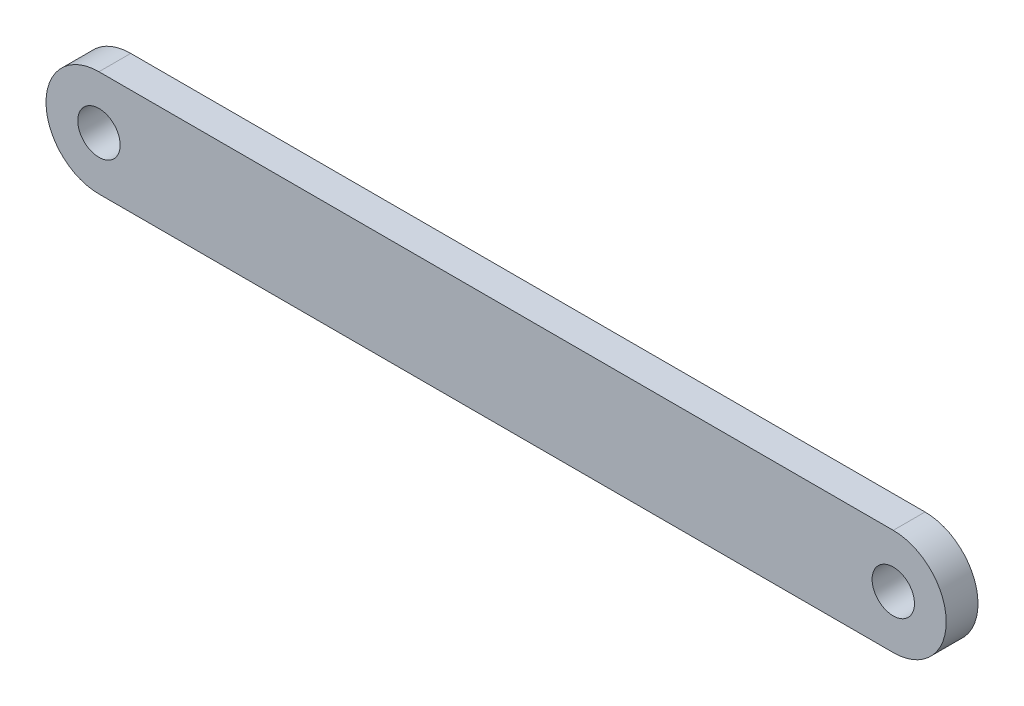
ISO-10303-21;
HEADER;
FILE_DESCRIPTION(('STEP AP214'),'2;1');
FILE_NAME('part.step','',(''),(''),'','','');
FILE_SCHEMA(('AUTOMOTIVE_DESIGN { 1 0 10303 214 1 1 1 1 }'));
ENDSEC;
DATA;
#1=APPLICATION_CONTEXT('core data for automotive mechanical design processes');
#2=APPLICATION_PROTOCOL_DEFINITION('international standard','automotive_design',2000,#1);
#3=PRODUCT_CONTEXT('',#1,'mechanical');
#4=PRODUCT('Part','Part','',(#3));
#5=PRODUCT_RELATED_PRODUCT_CATEGORY('part','',(#4));
#6=PRODUCT_DEFINITION_FORMATION('','',#4);
#7=PRODUCT_DEFINITION_CONTEXT('part definition',#1,'design');
#8=PRODUCT_DEFINITION('design','',#6,#7);
#9=PRODUCT_DEFINITION_SHAPE('','',#8);
#10=(LENGTH_UNIT() NAMED_UNIT(*) SI_UNIT(.MILLI.,.METRE.));
#11=(NAMED_UNIT(*) PLANE_ANGLE_UNIT() SI_UNIT($,.RADIAN.));
#12=(NAMED_UNIT(*) SI_UNIT($,.STERADIAN.) SOLID_ANGLE_UNIT());
#13=UNCERTAINTY_MEASURE_WITH_UNIT(LENGTH_MEASURE(1.E-05),#10,'distance_accuracy_value','');
#14=(GEOMETRIC_REPRESENTATION_CONTEXT(3) GLOBAL_UNCERTAINTY_ASSIGNED_CONTEXT((#13)) GLOBAL_UNIT_ASSIGNED_CONTEXT((#10,
#11,#12)) REPRESENTATION_CONTEXT('',''));
#15=CARTESIAN_POINT('',(0.,0.,0.));
#16=DIRECTION('',(0.,0.,1.));
#17=DIRECTION('',(1.,0.,0.));
#18=AXIS2_PLACEMENT_3D('',#15,#16,#17);
#19=CARTESIAN_POINT('',(120.078651701107,195.032322866027,3.));
#20=DIRECTION('',(0.,0.,1.));
#21=DIRECTION('',(1.,0.,0.));
#22=AXIS2_PLACEMENT_3D('',#19,#20,#21);
#23=PLANE('',#22);
#24=CARTESIAN_POINT('',(120.078651701107,195.032322866027,3.));
#25=DIRECTION('',(0.,0.,1.));
#26=DIRECTION('',(1.,0.,0.));
#27=AXIS2_PLACEMENT_3D('',#24,#25,#26);
#28=CIRCLE('',#27,2.);
#29=CARTESIAN_POINT('',(122.078651701107,195.032322866027,3.));
#30=VERTEX_POINT('',#29);
#31=EDGE_CURVE('E100',#30,#30,#28,.T.);
#32=ORIENTED_EDGE('',*,*,#31,.F.);
#33=EDGE_LOOP('',(#32));
#34=FACE_BOUND('',#33,.T.);
#35=CARTESIAN_POINT('',(120.078651701107,195.032322866027,3.));
#36=DIRECTION('',(0.,0.,1.));
#37=DIRECTION('',(1.,0.,0.));
#38=AXIS2_PLACEMENT_3D('',#35,#36,#37);
#39=CIRCLE('',#38,4.99999999999999);
#40=CARTESIAN_POINT('',(120.078651701107,200.032322866027,3.));
#41=VERTEX_POINT('',#40);
#42=CARTESIAN_POINT('',(120.078651701107,190.032322866027,3.));
#43=VERTEX_POINT('',#42);
#44=EDGE_CURVE('E85',#41,#43,#39,.T.);
#45=ORIENTED_EDGE('',*,*,#44,.T.);
#46=DIRECTION('',(1.,0.,0.));
#47=VECTOR('',#46,1.);
#48=CARTESIAN_POINT('',(120.078651701107,190.032322866027,3.));
#49=LINE('',#48,#47);
#50=CARTESIAN_POINT('',(195.078651701107,190.032322866027,3.));
#51=VERTEX_POINT('',#50);
#52=EDGE_CURVE('E80',#43,#51,#49,.T.);
#53=ORIENTED_EDGE('',*,*,#52,.T.);
#54=CARTESIAN_POINT('',(195.078651701107,195.032322866027,3.));
#55=DIRECTION('',(0.,0.,1.));
#56=DIRECTION('',(-1.,0.,0.));
#57=AXIS2_PLACEMENT_3D('',#54,#55,#56);
#58=CIRCLE('',#57,5.);
#59=CARTESIAN_POINT('',(195.078651701107,200.032322866027,3.));
#60=VERTEX_POINT('',#59);
#61=EDGE_CURVE('E83',#51,#60,#58,.T.);
#62=ORIENTED_EDGE('',*,*,#61,.T.);
#63=DIRECTION('',(-1.,0.,0.));
#64=VECTOR('',#63,1.);
#65=CARTESIAN_POINT('',(120.078651701107,200.032322866027,3.));
#66=LINE('',#65,#64);
#67=EDGE_CURVE('E50',#60,#41,#66,.T.);
#68=ORIENTED_EDGE('',*,*,#67,.T.);
#69=EDGE_LOOP('',(#45,#53,#62,#68));
#70=FACE_BOUND('',#69,.T.);
#71=CARTESIAN_POINT('',(195.078651701107,195.032322866027,3.));
#72=DIRECTION('',(0.,0.,1.));
#73=DIRECTION('',(1.,0.,0.));
#74=AXIS2_PLACEMENT_3D('',#71,#72,#73);
#75=CIRCLE('',#74,2.);
#76=CARTESIAN_POINT('',(197.078651701107,195.032322866027,3.));
#77=VERTEX_POINT('',#76);
#78=EDGE_CURVE('E115',#77,#77,#75,.T.);
#79=ORIENTED_EDGE('',*,*,#78,.F.);
#80=EDGE_LOOP('',(#79));
#81=FACE_BOUND('',#80,.T.);
#82=ADVANCED_FACE('F33',(#34,#70,#81),#23,.T.);
#83=CARTESIAN_POINT('',(120.078651701107,195.032322866027,0.));
#84=DIRECTION('',(0.,0.,1.));
#85=DIRECTION('',(1.,0.,0.));
#86=AXIS2_PLACEMENT_3D('',#83,#84,#85);
#87=PLANE('',#86);
#88=CARTESIAN_POINT('',(120.078651701107,195.032322866027,0.));
#89=DIRECTION('',(0.,0.,1.));
#90=DIRECTION('',(1.,0.,0.));
#91=AXIS2_PLACEMENT_3D('',#88,#89,#90);
#92=CIRCLE('',#91,4.99999999999999);
#93=CARTESIAN_POINT('',(120.078651701107,200.032322866027,0.));
#94=VERTEX_POINT('',#93);
#95=CARTESIAN_POINT('',(120.078651701107,190.032322866027,0.));
#96=VERTEX_POINT('',#95);
#97=EDGE_CURVE('E97',#94,#96,#92,.T.);
#98=ORIENTED_EDGE('',*,*,#97,.F.);
#99=DIRECTION('',(-1.,0.,0.));
#100=VECTOR('',#99,1.);
#101=CARTESIAN_POINT('',(120.078651701107,200.032322866027,0.));
#102=LINE('',#101,#100);
#103=CARTESIAN_POINT('',(195.078651701107,200.032322866027,0.));
#104=VERTEX_POINT('',#103);
#105=EDGE_CURVE('E73',#104,#94,#102,.T.);
#106=ORIENTED_EDGE('',*,*,#105,.F.);
#107=CARTESIAN_POINT('',(195.078651701107,195.032322866027,0.));
#108=DIRECTION('',(0.,0.,1.));
#109=DIRECTION('',(-1.,0.,0.));
#110=AXIS2_PLACEMENT_3D('',#107,#108,#109);
#111=CIRCLE('',#110,5.);
#112=CARTESIAN_POINT('',(195.078651701107,190.032322866027,0.));
#113=VERTEX_POINT('',#112);
#114=EDGE_CURVE('E67',#113,#104,#111,.T.);
#115=ORIENTED_EDGE('',*,*,#114,.F.);
#116=DIRECTION('',(1.,0.,0.));
#117=VECTOR('',#116,1.);
#118=CARTESIAN_POINT('',(120.078651701107,190.032322866027,0.));
#119=LINE('',#118,#117);
#120=EDGE_CURVE('E89',#96,#113,#119,.T.);
#121=ORIENTED_EDGE('',*,*,#120,.F.);
#122=EDGE_LOOP('',(#98,#106,#115,#121));
#123=FACE_BOUND('',#122,.T.);
#124=CARTESIAN_POINT('',(120.078651701107,195.032322866027,0.));
#125=DIRECTION('',(0.,0.,1.));
#126=DIRECTION('',(1.,0.,0.));
#127=AXIS2_PLACEMENT_3D('',#124,#125,#126);
#128=CIRCLE('',#127,2.);
#129=CARTESIAN_POINT('',(122.078651701107,195.032322866027,0.));
#130=VERTEX_POINT('',#129);
#131=EDGE_CURVE('E112',#130,#130,#128,.T.);
#132=ORIENTED_EDGE('',*,*,#131,.T.);
#133=EDGE_LOOP('',(#132));
#134=FACE_BOUND('',#133,.T.);
#135=CARTESIAN_POINT('',(195.078651701107,195.032322866027,0.));
#136=DIRECTION('',(0.,0.,1.));
#137=DIRECTION('',(1.,0.,0.));
#138=AXIS2_PLACEMENT_3D('',#135,#136,#137);
#139=CIRCLE('',#138,2.);
#140=CARTESIAN_POINT('',(197.078651701107,195.032322866027,0.));
#141=VERTEX_POINT('',#140);
#142=EDGE_CURVE('E118',#141,#141,#139,.T.);
#143=ORIENTED_EDGE('',*,*,#142,.T.);
#144=EDGE_LOOP('',(#143));
#145=FACE_BOUND('',#144,.T.);
#146=ADVANCED_FACE('F108',(#123,#134,#145),#87,.F.);
#147=CARTESIAN_POINT('',(120.078651701107,195.032322866027,3.));
#148=DIRECTION('',(0.,0.,-1.));
#149=DIRECTION('',(-1.,0.,0.));
#150=AXIS2_PLACEMENT_3D('',#147,#148,#149);
#151=CYLINDRICAL_SURFACE('',#150,4.99999999999999);
#152=ORIENTED_EDGE('',*,*,#97,.T.);
#153=DIRECTION('',(0.,0.,-1.));
#154=VECTOR('',#153,1.);
#155=CARTESIAN_POINT('',(120.078651701107,190.032322866027,3.));
#156=LINE('',#155,#154);
#157=EDGE_CURVE('E11',#43,#96,#156,.T.);
#158=ORIENTED_EDGE('',*,*,#157,.F.);
#159=ORIENTED_EDGE('',*,*,#44,.F.);
#160=DIRECTION('',(0.,0.,-1.));
#161=VECTOR('',#160,1.);
#162=CARTESIAN_POINT('',(120.078651701107,200.032322866027,3.));
#163=LINE('',#162,#161);
#164=EDGE_CURVE('E93',#41,#94,#163,.T.);
#165=ORIENTED_EDGE('',*,*,#164,.T.);
#166=EDGE_LOOP('',(#152,#158,#159,#165));
#167=FACE_BOUND('',#166,.T.);
#168=ADVANCED_FACE('F35',(#167),#151,.T.);
#169=CARTESIAN_POINT('',(120.078651701107,190.032322866027,3.));
#170=DIRECTION('',(0.,1.,0.));
#171=DIRECTION('',(0.,0.,1.));
#172=AXIS2_PLACEMENT_3D('',#169,#170,#171);
#173=PLANE('',#172);
#174=ORIENTED_EDGE('',*,*,#120,.T.);
#175=DIRECTION('',(0.,0.,-1.));
#176=VECTOR('',#175,1.);
#177=CARTESIAN_POINT('',(195.078651701107,190.032322866027,3.));
#178=LINE('',#177,#176);
#179=EDGE_CURVE('E42',#51,#113,#178,.T.);
#180=ORIENTED_EDGE('',*,*,#179,.F.);
#181=ORIENTED_EDGE('',*,*,#52,.F.);
#182=ORIENTED_EDGE('',*,*,#157,.T.);
#183=EDGE_LOOP('',(#174,#180,#181,#182));
#184=FACE_BOUND('',#183,.T.);
#185=ADVANCED_FACE('F88',(#184),#173,.F.);
#186=CARTESIAN_POINT('',(195.078651701107,195.032322866027,3.));
#187=DIRECTION('',(0.,0.,-1.));
#188=DIRECTION('',(-1.,0.,0.));
#189=AXIS2_PLACEMENT_3D('',#186,#187,#188);
#190=CYLINDRICAL_SURFACE('',#189,5.);
#191=ORIENTED_EDGE('',*,*,#114,.T.);
#192=DIRECTION('',(0.,0.,-1.));
#193=VECTOR('',#192,1.);
#194=CARTESIAN_POINT('',(195.078651701107,200.032322866027,3.));
#195=LINE('',#194,#193);
#196=EDGE_CURVE('E90',#60,#104,#195,.T.);
#197=ORIENTED_EDGE('',*,*,#196,.F.);
#198=ORIENTED_EDGE('',*,*,#61,.F.);
#199=ORIENTED_EDGE('',*,*,#179,.T.);
#200=EDGE_LOOP('',(#191,#197,#198,#199));
#201=FACE_BOUND('',#200,.T.);
#202=ADVANCED_FACE('F91',(#201),#190,.T.);
#203=CARTESIAN_POINT('',(120.078651701107,200.032322866027,3.));
#204=DIRECTION('',(0.,-1.,0.));
#205=DIRECTION('',(1.,0.,0.));
#206=AXIS2_PLACEMENT_3D('',#203,#204,#205);
#207=PLANE('',#206);
#208=ORIENTED_EDGE('',*,*,#105,.T.);
#209=ORIENTED_EDGE('',*,*,#164,.F.);
#210=ORIENTED_EDGE('',*,*,#67,.F.);
#211=ORIENTED_EDGE('',*,*,#196,.T.);
#212=EDGE_LOOP('',(#208,#209,#210,#211));
#213=FACE_BOUND('',#212,.T.);
#214=ADVANCED_FACE('F105',(#213),#207,.F.);
#215=CARTESIAN_POINT('',(120.078651701107,195.032322866027,3.));
#216=DIRECTION('',(0.,0.,-1.));
#217=DIRECTION('',(-1.,0.,0.));
#218=AXIS2_PLACEMENT_3D('',#215,#216,#217);
#219=CYLINDRICAL_SURFACE('',#218,2.);
#220=ORIENTED_EDGE('',*,*,#31,.T.);
#221=EDGE_LOOP('',(#220));
#222=FACE_BOUND('',#221,.T.);
#223=ORIENTED_EDGE('',*,*,#131,.F.);
#224=EDGE_LOOP('',(#223));
#225=FACE_BOUND('',#224,.T.);
#226=ADVANCED_FACE('F135',(#222,#225),#219,.F.);
#227=CARTESIAN_POINT('',(195.078651701107,195.032322866027,3.));
#228=DIRECTION('',(0.,0.,-1.));
#229=DIRECTION('',(-1.,0.,0.));
#230=AXIS2_PLACEMENT_3D('',#227,#228,#229);
#231=CYLINDRICAL_SURFACE('',#230,2.);
#232=ORIENTED_EDGE('',*,*,#78,.T.);
#233=EDGE_LOOP('',(#232));
#234=FACE_BOUND('',#233,.T.);
#235=ORIENTED_EDGE('',*,*,#142,.F.);
#236=EDGE_LOOP('',(#235));
#237=FACE_BOUND('',#236,.T.);
#238=ADVANCED_FACE('F124',(#234,#237),#231,.F.);
#239=CLOSED_SHELL('',(#82,#146,#168,#185,#202,#214,#226,#238));
#240=MANIFOLD_SOLID_BREP('B2',#239);
#241=ADVANCED_BREP_SHAPE_REPRESENTATION('',(#18,#240),#14);
#242=SHAPE_DEFINITION_REPRESENTATION(#9,#241);
ENDSEC;
END-ISO-10303-21;
